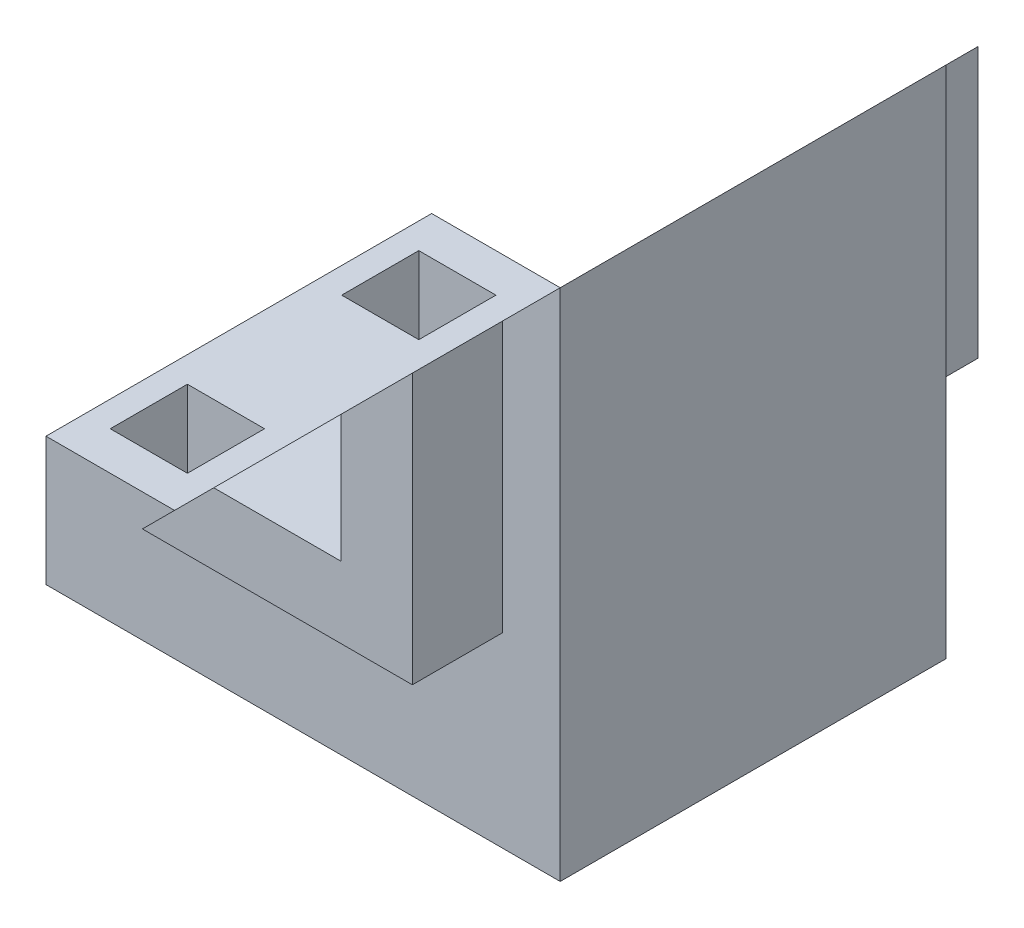
ISO-10303-21;
HEADER;
FILE_DESCRIPTION(('STEP AP214'),'2;1');
FILE_NAME('part.step','',(''),(''),'','','');
FILE_SCHEMA(('AUTOMOTIVE_DESIGN { 1 0 10303 214 1 1 1 1 }'));
ENDSEC;
DATA;
#1=APPLICATION_CONTEXT('core data for automotive mechanical design processes');
#2=APPLICATION_PROTOCOL_DEFINITION('international standard','automotive_design',2000,#1);
#3=PRODUCT_CONTEXT('',#1,'mechanical');
#4=PRODUCT('Part','Part','',(#3));
#5=PRODUCT_RELATED_PRODUCT_CATEGORY('part','',(#4));
#6=PRODUCT_DEFINITION_FORMATION('','',#4);
#7=PRODUCT_DEFINITION_CONTEXT('part definition',#1,'design');
#8=PRODUCT_DEFINITION('design','',#6,#7);
#9=PRODUCT_DEFINITION_SHAPE('','',#8);
#10=(LENGTH_UNIT() NAMED_UNIT(*) SI_UNIT(.MILLI.,.METRE.));
#11=(NAMED_UNIT(*) PLANE_ANGLE_UNIT() SI_UNIT($,.RADIAN.));
#12=(NAMED_UNIT(*) SI_UNIT($,.STERADIAN.) SOLID_ANGLE_UNIT());
#13=UNCERTAINTY_MEASURE_WITH_UNIT(LENGTH_MEASURE(1.E-05),#10,'distance_accuracy_value','');
#14=(GEOMETRIC_REPRESENTATION_CONTEXT(3) GLOBAL_UNCERTAINTY_ASSIGNED_CONTEXT((#13)) GLOBAL_UNIT_ASSIGNED_CONTEXT((#10,
#11,#12)) REPRESENTATION_CONTEXT('',''));
#15=CARTESIAN_POINT('',(0.,0.,0.));
#16=DIRECTION('',(0.,0.,1.));
#17=DIRECTION('',(1.,0.,0.));
#18=AXIS2_PLACEMENT_3D('',#15,#16,#17);
#19=CARTESIAN_POINT('',(0.,-20.,-15.));
#20=DIRECTION('',(0.,-1.,0.));
#21=DIRECTION('',(0.,0.,-1.));
#22=AXIS2_PLACEMENT_3D('',#19,#20,#21);
#23=PLANE('',#22);
#24=DIRECTION('',(0.,0.,1.));
#25=VECTOR('',#24,1.);
#26=CARTESIAN_POINT('',(20.,-20.,-15.));
#27=LINE('',#26,#25);
#28=CARTESIAN_POINT('',(20.,-20.,-15.));
#29=VERTEX_POINT('',#28);
#30=CARTESIAN_POINT('',(20.,-20.,15.));
#31=VERTEX_POINT('',#30);
#32=EDGE_CURVE('E43',#29,#31,#27,.T.);
#33=ORIENTED_EDGE('',*,*,#32,.T.);
#34=DIRECTION('',(1.,0.,0.));
#35=VECTOR('',#34,1.);
#36=CARTESIAN_POINT('',(0.,-20.,15.));
#37=LINE('',#36,#35);
#38=CARTESIAN_POINT('',(-20.,-20.,15.));
#39=VERTEX_POINT('',#38);
#40=EDGE_CURVE('E313',#39,#31,#37,.T.);
#41=ORIENTED_EDGE('',*,*,#40,.F.);
#42=DIRECTION('',(0.,0.,1.));
#43=VECTOR('',#42,1.);
#44=CARTESIAN_POINT('',(-20.,-20.,-15.));
#45=LINE('',#44,#43);
#46=CARTESIAN_POINT('',(-20.,-20.,-15.));
#47=VERTEX_POINT('',#46);
#48=EDGE_CURVE('E338',#47,#39,#45,.T.);
#49=ORIENTED_EDGE('',*,*,#48,.F.);
#50=DIRECTION('',(1.,0.,0.));
#51=VECTOR('',#50,1.);
#52=CARTESIAN_POINT('',(0.,-20.,-15.));
#53=LINE('',#52,#51);
#54=EDGE_CURVE('E331',#47,#29,#53,.T.);
#55=ORIENTED_EDGE('',*,*,#54,.T.);
#56=EDGE_LOOP('',(#33,#41,#49,#55));
#57=FACE_BOUND('',#56,.T.);
#58=DIRECTION('',(0.,0.,-1.));
#59=VECTOR('',#58,1.);
#60=CARTESIAN_POINT('',(-12.,-20.,6.));
#61=LINE('',#60,#59);
#62=CARTESIAN_POINT('',(-12.,-20.,12.));
#63=VERTEX_POINT('',#62);
#64=CARTESIAN_POINT('',(-12.,-20.,6.));
#65=VERTEX_POINT('',#64);
#66=EDGE_CURVE('E218',#63,#65,#61,.T.);
#67=ORIENTED_EDGE('',*,*,#66,.T.);
#68=DIRECTION('',(-1.,0.,0.));
#69=VECTOR('',#68,1.);
#70=CARTESIAN_POINT('',(-18.,-20.,6.));
#71=LINE('',#70,#69);
#72=CARTESIAN_POINT('',(-18.,-20.,6.));
#73=VERTEX_POINT('',#72);
#74=EDGE_CURVE('E221',#65,#73,#71,.T.);
#75=ORIENTED_EDGE('',*,*,#74,.T.);
#76=DIRECTION('',(0.,0.,1.));
#77=VECTOR('',#76,1.);
#78=CARTESIAN_POINT('',(-18.,-20.,6.));
#79=LINE('',#78,#77);
#80=CARTESIAN_POINT('',(-18.,-20.,12.));
#81=VERTEX_POINT('',#80);
#82=EDGE_CURVE('E225',#73,#81,#79,.T.);
#83=ORIENTED_EDGE('',*,*,#82,.T.);
#84=DIRECTION('',(1.,0.,0.));
#85=VECTOR('',#84,1.);
#86=CARTESIAN_POINT('',(-18.,-20.,12.));
#87=LINE('',#86,#85);
#88=EDGE_CURVE('E228',#81,#63,#87,.T.);
#89=ORIENTED_EDGE('',*,*,#88,.T.);
#90=EDGE_LOOP('',(#67,#75,#83,#89));
#91=FACE_BOUND('',#90,.T.);
#92=DIRECTION('',(-1.,0.,0.));
#93=VECTOR('',#92,1.);
#94=CARTESIAN_POINT('',(-18.,-20.,-6.));
#95=LINE('',#94,#93);
#96=CARTESIAN_POINT('',(-12.,-20.,-6.));
#97=VERTEX_POINT('',#96);
#98=CARTESIAN_POINT('',(-18.,-20.,-6.));
#99=VERTEX_POINT('',#98);
#100=EDGE_CURVE('E196',#97,#99,#95,.T.);
#101=ORIENTED_EDGE('',*,*,#100,.F.);
#102=DIRECTION('',(0.,0.,1.));
#103=VECTOR('',#102,1.);
#104=CARTESIAN_POINT('',(-12.,-20.,-6.));
#105=LINE('',#104,#103);
#106=CARTESIAN_POINT('',(-12.,-20.,-12.));
#107=VERTEX_POINT('',#106);
#108=EDGE_CURVE('E192',#107,#97,#105,.T.);
#109=ORIENTED_EDGE('',*,*,#108,.F.);
#110=DIRECTION('',(1.,0.,0.));
#111=VECTOR('',#110,1.);
#112=CARTESIAN_POINT('',(-18.,-20.,-12.));
#113=LINE('',#112,#111);
#114=CARTESIAN_POINT('',(-18.,-20.,-12.));
#115=VERTEX_POINT('',#114);
#116=EDGE_CURVE('E184',#115,#107,#113,.T.);
#117=ORIENTED_EDGE('',*,*,#116,.F.);
#118=DIRECTION('',(0.,0.,-1.));
#119=VECTOR('',#118,1.);
#120=CARTESIAN_POINT('',(-18.,-20.,-6.));
#121=LINE('',#120,#119);
#122=EDGE_CURVE('E191',#99,#115,#121,.T.);
#123=ORIENTED_EDGE('',*,*,#122,.F.);
#124=EDGE_LOOP('',(#101,#109,#117,#123));
#125=FACE_BOUND('',#124,.T.);
#126=ADVANCED_FACE('F34',(#57,#91,#125),#23,.T.);
#127=CARTESIAN_POINT('',(0.,-10.,-15.));
#128=DIRECTION('',(0.,-1.,0.));
#129=DIRECTION('',(0.,0.,-1.));
#130=AXIS2_PLACEMENT_3D('',#127,#128,#129);
#131=PLANE('',#130);
#132=DIRECTION('',(0.,0.,1.));
#133=VECTOR('',#132,1.);
#134=CARTESIAN_POINT('',(-20.,-10.,-15.));
#135=LINE('',#134,#133);
#136=CARTESIAN_POINT('',(-20.,-10.,-15.));
#137=VERTEX_POINT('',#136);
#138=CARTESIAN_POINT('',(-20.,-10.,15.));
#139=VERTEX_POINT('',#138);
#140=EDGE_CURVE('E339',#137,#139,#135,.T.);
#141=ORIENTED_EDGE('',*,*,#140,.T.);
#142=DIRECTION('',(1.,0.,0.));
#143=VECTOR('',#142,1.);
#144=CARTESIAN_POINT('',(0.,-10.,15.));
#145=LINE('',#144,#143);
#146=CARTESIAN_POINT('',(-10.,-10.,15.));
#147=VERTEX_POINT('',#146);
#148=EDGE_CURVE('E306',#139,#147,#145,.T.);
#149=ORIENTED_EDGE('',*,*,#148,.T.);
#150=DIRECTION('',(0.,0.,1.));
#151=VECTOR('',#150,1.);
#152=CARTESIAN_POINT('',(-10.,-10.,-15.));
#153=LINE('',#152,#151);
#154=CARTESIAN_POINT('',(-10.,-10.,-15.));
#155=VERTEX_POINT('',#154);
#156=EDGE_CURVE('E38',#155,#147,#153,.T.);
#157=ORIENTED_EDGE('',*,*,#156,.F.);
#158=DIRECTION('',(1.,0.,0.));
#159=VECTOR('',#158,1.);
#160=CARTESIAN_POINT('',(0.,-10.,-15.));
#161=LINE('',#160,#159);
#162=EDGE_CURVE('E326',#137,#155,#161,.T.);
#163=ORIENTED_EDGE('',*,*,#162,.F.);
#164=EDGE_LOOP('',(#141,#149,#157,#163));
#165=FACE_BOUND('',#164,.T.);
#166=DIRECTION('',(-1.,0.,0.));
#167=VECTOR('',#166,1.);
#168=CARTESIAN_POINT('',(-18.,-10.,6.));
#169=LINE('',#168,#167);
#170=CARTESIAN_POINT('',(-12.,-10.,6.));
#171=VERTEX_POINT('',#170);
#172=CARTESIAN_POINT('',(-18.,-10.,6.));
#173=VERTEX_POINT('',#172);
#174=EDGE_CURVE('E233',#171,#173,#169,.T.);
#175=ORIENTED_EDGE('',*,*,#174,.F.);
#176=DIRECTION('',(0.,0.,-1.));
#177=VECTOR('',#176,1.);
#178=CARTESIAN_POINT('',(-12.,-10.,6.));
#179=LINE('',#178,#177);
#180=CARTESIAN_POINT('',(-12.,-10.,12.));
#181=VERTEX_POINT('',#180);
#182=EDGE_CURVE('E214',#181,#171,#179,.T.);
#183=ORIENTED_EDGE('',*,*,#182,.F.);
#184=DIRECTION('',(1.,0.,0.));
#185=VECTOR('',#184,1.);
#186=CARTESIAN_POINT('',(-18.,-10.,12.));
#187=LINE('',#186,#185);
#188=CARTESIAN_POINT('',(-18.,-10.,12.));
#189=VERTEX_POINT('',#188);
#190=EDGE_CURVE('E222',#189,#181,#187,.T.);
#191=ORIENTED_EDGE('',*,*,#190,.F.);
#192=DIRECTION('',(0.,0.,1.));
#193=VECTOR('',#192,1.);
#194=CARTESIAN_POINT('',(-18.,-10.,6.));
#195=LINE('',#194,#193);
#196=EDGE_CURVE('E236',#173,#189,#195,.T.);
#197=ORIENTED_EDGE('',*,*,#196,.F.);
#198=EDGE_LOOP('',(#175,#183,#191,#197));
#199=FACE_BOUND('',#198,.T.);
#200=DIRECTION('',(0.,0.,1.));
#201=VECTOR('',#200,1.);
#202=CARTESIAN_POINT('',(-12.,-10.,-6.));
#203=LINE('',#202,#201);
#204=CARTESIAN_POINT('',(-12.,-10.,-12.));
#205=VERTEX_POINT('',#204);
#206=CARTESIAN_POINT('',(-12.,-10.,-6.));
#207=VERTEX_POINT('',#206);
#208=EDGE_CURVE('E59',#205,#207,#203,.T.);
#209=ORIENTED_EDGE('',*,*,#208,.T.);
#210=DIRECTION('',(-1.,0.,0.));
#211=VECTOR('',#210,1.);
#212=CARTESIAN_POINT('',(-18.,-10.,-6.));
#213=LINE('',#212,#211);
#214=CARTESIAN_POINT('',(-18.,-10.,-6.));
#215=VERTEX_POINT('',#214);
#216=EDGE_CURVE('E199',#207,#215,#213,.T.);
#217=ORIENTED_EDGE('',*,*,#216,.T.);
#218=DIRECTION('',(0.,0.,-1.));
#219=VECTOR('',#218,1.);
#220=CARTESIAN_POINT('',(-18.,-10.,-6.));
#221=LINE('',#220,#219);
#222=CARTESIAN_POINT('',(-18.,-10.,-12.));
#223=VERTEX_POINT('',#222);
#224=EDGE_CURVE('E202',#215,#223,#221,.T.);
#225=ORIENTED_EDGE('',*,*,#224,.T.);
#226=DIRECTION('',(1.,0.,0.));
#227=VECTOR('',#226,1.);
#228=CARTESIAN_POINT('',(-18.,-10.,-12.));
#229=LINE('',#228,#227);
#230=EDGE_CURVE('E208',#223,#205,#229,.T.);
#231=ORIENTED_EDGE('',*,*,#230,.T.);
#232=EDGE_LOOP('',(#209,#217,#225,#231));
#233=FACE_BOUND('',#232,.T.);
#234=ADVANCED_FACE('F36',(#165,#199,#233),#131,.F.);
#235=CARTESIAN_POINT('',(0.,0.,-15.));
#236=DIRECTION('',(0.707106781186547,-0.707106781186547,0.));
#237=DIRECTION('',(0.707106781186548,0.707106781186548,0.));
#238=AXIS2_PLACEMENT_3D('',#235,#236,#237);
#239=PLANE('',#238);
#240=DIRECTION('',(0.707106781186548,0.707106781186548,0.));
#241=VECTOR('',#240,1.);
#242=CARTESIAN_POINT('',(0.,0.,-15.));
#243=LINE('',#242,#241);
#244=CARTESIAN_POINT('',(15.5,15.5,-15.));
#245=VERTEX_POINT('',#244);
#246=CARTESIAN_POINT('',(20.,20.,-15.));
#247=VERTEX_POINT('',#246);
#248=EDGE_CURVE('E327',#245,#247,#243,.T.);
#249=ORIENTED_EDGE('',*,*,#248,.F.);
#250=DIRECTION('',(0.,0.,1.));
#251=VECTOR('',#250,1.);
#252=CARTESIAN_POINT('',(15.5,15.5,-22.));
#253=LINE('',#252,#251);
#254=CARTESIAN_POINT('',(15.5,15.5,-22.));
#255=VERTEX_POINT('',#254);
#256=EDGE_CURVE('E282',#255,#245,#253,.T.);
#257=ORIENTED_EDGE('',*,*,#256,.F.);
#258=DIRECTION('',(0.707106781186548,0.707106781186548,0.));
#259=VECTOR('',#258,1.);
#260=CARTESIAN_POINT('',(0.,0.,-22.));
#261=LINE('',#260,#259);
#262=CARTESIAN_POINT('',(9.94974746830583,9.94974746830583,-22.));
#263=VERTEX_POINT('',#262);
#264=EDGE_CURVE('E273',#263,#255,#261,.T.);
#265=ORIENTED_EDGE('',*,*,#264,.F.);
#266=DIRECTION('',(0.,0.,1.));
#267=VECTOR('',#266,1.);
#268=CARTESIAN_POINT('',(9.94974746830583,9.94974746830583,-22.));
#269=LINE('',#268,#267);
#270=CARTESIAN_POINT('',(9.94974746830583,9.94974746830583,22.));
#271=VERTEX_POINT('',#270);
#272=EDGE_CURVE('E279',#263,#271,#269,.T.);
#273=ORIENTED_EDGE('',*,*,#272,.T.);
#274=DIRECTION('',(0.707106781186548,0.707106781186548,0.));
#275=VECTOR('',#274,1.);
#276=CARTESIAN_POINT('',(0.,0.,22.));
#277=LINE('',#276,#275);
#278=CARTESIAN_POINT('',(15.5,15.5,22.));
#279=VERTEX_POINT('',#278);
#280=EDGE_CURVE('E259',#271,#279,#277,.T.);
#281=ORIENTED_EDGE('',*,*,#280,.T.);
#282=CARTESIAN_POINT('',(15.5,15.5,15.));
#283=VERTEX_POINT('',#282);
#284=EDGE_CURVE('E285',#283,#279,#253,.T.);
#285=ORIENTED_EDGE('',*,*,#284,.F.);
#286=DIRECTION('',(0.707106781186548,0.707106781186548,0.));
#287=VECTOR('',#286,1.);
#288=CARTESIAN_POINT('',(0.,0.,15.));
#289=LINE('',#288,#287);
#290=CARTESIAN_POINT('',(20.,20.,15.));
#291=VERTEX_POINT('',#290);
#292=EDGE_CURVE('E307',#283,#291,#289,.T.);
#293=ORIENTED_EDGE('',*,*,#292,.T.);
#294=DIRECTION('',(0.,0.,1.));
#295=VECTOR('',#294,1.);
#296=CARTESIAN_POINT('',(20.,20.,-15.));
#297=LINE('',#296,#295);
#298=EDGE_CURVE('E11',#247,#291,#297,.T.);
#299=ORIENTED_EDGE('',*,*,#298,.F.);
#300=EDGE_LOOP('',(#249,#257,#265,#273,#281,#285,#293,#299));
#301=FACE_BOUND('',#300,.T.);
#302=ADVANCED_FACE('F357',(#301),#239,.F.);
#303=CARTESIAN_POINT('',(20.,0.,-15.));
#304=DIRECTION('',(1.,0.,0.));
#305=DIRECTION('',(0.,0.,-1.));
#306=AXIS2_PLACEMENT_3D('',#303,#304,#305);
#307=PLANE('',#306);
#308=ORIENTED_EDGE('',*,*,#298,.T.);
#309=DIRECTION('',(0.,1.,0.));
#310=VECTOR('',#309,1.);
#311=CARTESIAN_POINT('',(20.,0.,15.));
#312=LINE('',#311,#310);
#313=EDGE_CURVE('E316',#31,#291,#312,.T.);
#314=ORIENTED_EDGE('',*,*,#313,.F.);
#315=ORIENTED_EDGE('',*,*,#32,.F.);
#316=DIRECTION('',(0.,1.,0.));
#317=VECTOR('',#316,1.);
#318=CARTESIAN_POINT('',(20.,0.,-15.));
#319=LINE('',#318,#317);
#320=EDGE_CURVE('E334',#29,#247,#319,.T.);
#321=ORIENTED_EDGE('',*,*,#320,.T.);
#322=EDGE_LOOP('',(#308,#314,#315,#321));
#323=FACE_BOUND('',#322,.T.);
#324=ADVANCED_FACE('F361',(#323),#307,.T.);
#325=CARTESIAN_POINT('',(-20.,0.,-15.));
#326=DIRECTION('',(1.,0.,0.));
#327=DIRECTION('',(0.,0.,-1.));
#328=AXIS2_PLACEMENT_3D('',#325,#326,#327);
#329=PLANE('',#328);
#330=ORIENTED_EDGE('',*,*,#48,.T.);
#331=DIRECTION('',(0.,1.,0.));
#332=VECTOR('',#331,1.);
#333=CARTESIAN_POINT('',(-20.,0.,15.));
#334=LINE('',#333,#332);
#335=EDGE_CURVE('E310',#39,#139,#334,.T.);
#336=ORIENTED_EDGE('',*,*,#335,.T.);
#337=ORIENTED_EDGE('',*,*,#140,.F.);
#338=DIRECTION('',(0.,1.,0.));
#339=VECTOR('',#338,1.);
#340=CARTESIAN_POINT('',(-20.,0.,-15.));
#341=LINE('',#340,#339);
#342=EDGE_CURVE('E329',#47,#137,#341,.T.);
#343=ORIENTED_EDGE('',*,*,#342,.F.);
#344=EDGE_LOOP('',(#330,#336,#337,#343));
#345=FACE_BOUND('',#344,.T.);
#346=ADVANCED_FACE('F369',(#345),#329,.F.);
#347=ORIENTED_EDGE('',*,*,#156,.T.);
#348=CARTESIAN_POINT('',(-5.5,-5.5,15.));
#349=VERTEX_POINT('',#348);
#350=EDGE_CURVE('E303',#147,#349,#289,.T.);
#351=ORIENTED_EDGE('',*,*,#350,.T.);
#352=DIRECTION('',(0.,0.,1.));
#353=VECTOR('',#352,1.);
#354=CARTESIAN_POINT('',(-5.5,-5.5,-22.));
#355=LINE('',#354,#353);
#356=CARTESIAN_POINT('',(-5.5,-5.5,22.));
#357=VERTEX_POINT('',#356);
#358=EDGE_CURVE('E293',#349,#357,#355,.T.);
#359=ORIENTED_EDGE('',*,*,#358,.T.);
#360=CARTESIAN_POINT('',(0.0502525316941692,0.0502525316941692,22.));
#361=VERTEX_POINT('',#360);
#362=EDGE_CURVE('E255',#357,#361,#277,.T.);
#363=ORIENTED_EDGE('',*,*,#362,.T.);
#364=DIRECTION('',(0.,0.,1.));
#365=VECTOR('',#364,1.);
#366=CARTESIAN_POINT('',(0.0502525316941692,0.0502525316941692,-22.));
#367=LINE('',#366,#365);
#368=CARTESIAN_POINT('',(0.0502525316941692,0.0502525316941692,-22.));
#369=VERTEX_POINT('',#368);
#370=EDGE_CURVE('E294',#369,#361,#367,.T.);
#371=ORIENTED_EDGE('',*,*,#370,.F.);
#372=CARTESIAN_POINT('',(-5.5,-5.5,-22.));
#373=VERTEX_POINT('',#372);
#374=EDGE_CURVE('E270',#373,#369,#261,.T.);
#375=ORIENTED_EDGE('',*,*,#374,.F.);
#376=CARTESIAN_POINT('',(-5.5,-5.5,-15.));
#377=VERTEX_POINT('',#376);
#378=EDGE_CURVE('E290',#373,#377,#355,.T.);
#379=ORIENTED_EDGE('',*,*,#378,.T.);
#380=EDGE_CURVE('E324',#155,#377,#243,.T.);
#381=ORIENTED_EDGE('',*,*,#380,.F.);
#382=EDGE_LOOP('',(#347,#351,#359,#363,#371,#375,#379,#381));
#383=FACE_BOUND('',#382,.T.);
#384=ADVANCED_FACE('F373',(#383),#239,.F.);
#385=CARTESIAN_POINT('',(0.,0.,-15.));
#386=DIRECTION('',(0.,0.,1.));
#387=DIRECTION('',(1.,0.,0.));
#388=AXIS2_PLACEMENT_3D('',#385,#386,#387);
#389=PLANE('',#388);
#390=DIRECTION('',(0.,1.,0.));
#391=VECTOR('',#390,1.);
#392=CARTESIAN_POINT('',(15.5,0.,-15.));
#393=LINE('',#392,#391);
#394=CARTESIAN_POINT('',(15.5,-5.5,-15.));
#395=VERTEX_POINT('',#394);
#396=EDGE_CURVE('E319',#395,#245,#393,.T.);
#397=ORIENTED_EDGE('',*,*,#396,.T.);
#398=ORIENTED_EDGE('',*,*,#248,.T.);
#399=ORIENTED_EDGE('',*,*,#320,.F.);
#400=ORIENTED_EDGE('',*,*,#54,.F.);
#401=ORIENTED_EDGE('',*,*,#342,.T.);
#402=ORIENTED_EDGE('',*,*,#162,.T.);
#403=ORIENTED_EDGE('',*,*,#380,.T.);
#404=DIRECTION('',(1.,0.,0.));
#405=VECTOR('',#404,1.);
#406=CARTESIAN_POINT('',(0.,-5.5,-15.));
#407=LINE('',#406,#405);
#408=EDGE_CURVE('E322',#377,#395,#407,.T.);
#409=ORIENTED_EDGE('',*,*,#408,.T.);
#410=EDGE_LOOP('',(#397,#398,#399,#400,#401,#402,#403,#409));
#411=FACE_BOUND('',#410,.T.);
#412=ADVANCED_FACE('F351',(#411),#389,.F.);
#413=CARTESIAN_POINT('',(0.,0.,15.));
#414=DIRECTION('',(0.,0.,1.));
#415=DIRECTION('',(1.,0.,0.));
#416=AXIS2_PLACEMENT_3D('',#413,#414,#415);
#417=PLANE('',#416);
#418=DIRECTION('',(0.,1.,0.));
#419=VECTOR('',#418,1.);
#420=CARTESIAN_POINT('',(15.5,0.,15.));
#421=LINE('',#420,#419);
#422=CARTESIAN_POINT('',(15.5,-5.5,15.));
#423=VERTEX_POINT('',#422);
#424=EDGE_CURVE('E281',#423,#283,#421,.T.);
#425=ORIENTED_EDGE('',*,*,#424,.F.);
#426=DIRECTION('',(1.,0.,0.));
#427=VECTOR('',#426,1.);
#428=CARTESIAN_POINT('',(0.,-5.5,15.));
#429=LINE('',#428,#427);
#430=EDGE_CURVE('E300',#349,#423,#429,.T.);
#431=ORIENTED_EDGE('',*,*,#430,.F.);
#432=ORIENTED_EDGE('',*,*,#350,.F.);
#433=ORIENTED_EDGE('',*,*,#148,.F.);
#434=ORIENTED_EDGE('',*,*,#335,.F.);
#435=ORIENTED_EDGE('',*,*,#40,.T.);
#436=ORIENTED_EDGE('',*,*,#313,.T.);
#437=ORIENTED_EDGE('',*,*,#292,.F.);
#438=EDGE_LOOP('',(#425,#431,#432,#433,#434,#435,#436,#437));
#439=FACE_BOUND('',#438,.T.);
#440=ADVANCED_FACE('F367',(#439),#417,.T.);
#441=CARTESIAN_POINT('',(15.5,0.,-22.));
#442=DIRECTION('',(1.,0.,0.));
#443=DIRECTION('',(0.,0.,-1.));
#444=AXIS2_PLACEMENT_3D('',#441,#442,#443);
#445=PLANE('',#444);
#446=ORIENTED_EDGE('',*,*,#396,.F.);
#447=DIRECTION('',(0.,0.,1.));
#448=VECTOR('',#447,1.);
#449=CARTESIAN_POINT('',(15.5,-5.5,-22.));
#450=LINE('',#449,#448);
#451=CARTESIAN_POINT('',(15.5,-5.5,-22.));
#452=VERTEX_POINT('',#451);
#453=EDGE_CURVE('E286',#452,#395,#450,.T.);
#454=ORIENTED_EDGE('',*,*,#453,.F.);
#455=DIRECTION('',(0.,1.,0.));
#456=VECTOR('',#455,1.);
#457=CARTESIAN_POINT('',(15.5,0.,-22.));
#458=LINE('',#457,#456);
#459=EDGE_CURVE('E276',#452,#255,#458,.T.);
#460=ORIENTED_EDGE('',*,*,#459,.T.);
#461=ORIENTED_EDGE('',*,*,#256,.T.);
#462=EDGE_LOOP('',(#446,#454,#460,#461));
#463=FACE_BOUND('',#462,.T.);
#464=ADVANCED_FACE('F380',(#463),#445,.T.);
#465=CARTESIAN_POINT('',(0.,-5.5,-22.));
#466=DIRECTION('',(0.,-1.,0.));
#467=DIRECTION('',(0.,0.,-1.));
#468=AXIS2_PLACEMENT_3D('',#465,#466,#467);
#469=PLANE('',#468);
#470=ORIENTED_EDGE('',*,*,#408,.F.);
#471=ORIENTED_EDGE('',*,*,#378,.F.);
#472=DIRECTION('',(1.,0.,0.));
#473=VECTOR('',#472,1.);
#474=CARTESIAN_POINT('',(0.,-5.5,-22.));
#475=LINE('',#474,#473);
#476=EDGE_CURVE('E272',#373,#452,#475,.T.);
#477=ORIENTED_EDGE('',*,*,#476,.T.);
#478=ORIENTED_EDGE('',*,*,#453,.T.);
#479=EDGE_LOOP('',(#470,#471,#477,#478));
#480=FACE_BOUND('',#479,.T.);
#481=ADVANCED_FACE('F378',(#480),#469,.T.);
#482=CARTESIAN_POINT('',(9.94974746830584,0.,-22.));
#483=DIRECTION('',(1.,0.,0.));
#484=DIRECTION('',(0.,0.,-1.));
#485=AXIS2_PLACEMENT_3D('',#482,#483,#484);
#486=PLANE('',#485);
#487=DIRECTION('',(0.,0.,1.));
#488=VECTOR('',#487,1.);
#489=CARTESIAN_POINT('',(9.94974746830584,0.0502525316941692,-22.));
#490=LINE('',#489,#488);
#491=CARTESIAN_POINT('',(9.94974746830584,0.0502525316941692,-22.));
#492=VERTEX_POINT('',#491);
#493=CARTESIAN_POINT('',(9.94974746830584,0.0502525316941692,22.));
#494=VERTEX_POINT('',#493);
#495=EDGE_CURVE('E296',#492,#494,#490,.T.);
#496=ORIENTED_EDGE('',*,*,#495,.T.);
#497=DIRECTION('',(0.,1.,0.));
#498=VECTOR('',#497,1.);
#499=CARTESIAN_POINT('',(9.94974746830584,0.,22.));
#500=LINE('',#499,#498);
#501=EDGE_CURVE('E243',#494,#271,#500,.T.);
#502=ORIENTED_EDGE('',*,*,#501,.T.);
#503=ORIENTED_EDGE('',*,*,#272,.F.);
#504=DIRECTION('',(0.,1.,0.));
#505=VECTOR('',#504,1.);
#506=CARTESIAN_POINT('',(9.94974746830584,0.,-22.));
#507=LINE('',#506,#505);
#508=EDGE_CURVE('E265',#492,#263,#507,.T.);
#509=ORIENTED_EDGE('',*,*,#508,.F.);
#510=EDGE_LOOP('',(#496,#502,#503,#509));
#511=FACE_BOUND('',#510,.T.);
#512=ADVANCED_FACE('F390',(#511),#486,.F.);
#513=CARTESIAN_POINT('',(15.5,-5.5,22.));
#514=VERTEX_POINT('',#513);
#515=EDGE_CURVE('E289',#423,#514,#450,.T.);
#516=ORIENTED_EDGE('',*,*,#515,.F.);
#517=ORIENTED_EDGE('',*,*,#424,.T.);
#518=ORIENTED_EDGE('',*,*,#284,.T.);
#519=DIRECTION('',(0.,1.,0.));
#520=VECTOR('',#519,1.);
#521=CARTESIAN_POINT('',(15.5,0.,22.));
#522=LINE('',#521,#520);
#523=EDGE_CURVE('E262',#514,#279,#522,.T.);
#524=ORIENTED_EDGE('',*,*,#523,.F.);
#525=EDGE_LOOP('',(#516,#517,#518,#524));
#526=FACE_BOUND('',#525,.T.);
#527=ADVANCED_FACE('F399',(#526),#445,.T.);
#528=ORIENTED_EDGE('',*,*,#358,.F.);
#529=ORIENTED_EDGE('',*,*,#430,.T.);
#530=ORIENTED_EDGE('',*,*,#515,.T.);
#531=DIRECTION('',(1.,0.,0.));
#532=VECTOR('',#531,1.);
#533=CARTESIAN_POINT('',(0.,-5.5,22.));
#534=LINE('',#533,#532);
#535=EDGE_CURVE('E258',#357,#514,#534,.T.);
#536=ORIENTED_EDGE('',*,*,#535,.F.);
#537=EDGE_LOOP('',(#528,#529,#530,#536));
#538=FACE_BOUND('',#537,.T.);
#539=ADVANCED_FACE('F402',(#538),#469,.T.);
#540=CARTESIAN_POINT('',(0.,0.0502525316941692,-22.));
#541=DIRECTION('',(0.,-1.,0.));
#542=DIRECTION('',(0.,0.,-1.));
#543=AXIS2_PLACEMENT_3D('',#540,#541,#542);
#544=PLANE('',#543);
#545=ORIENTED_EDGE('',*,*,#370,.T.);
#546=DIRECTION('',(1.,0.,0.));
#547=VECTOR('',#546,1.);
#548=CARTESIAN_POINT('',(0.,0.0502525316941692,22.));
#549=LINE('',#548,#547);
#550=EDGE_CURVE('E252',#361,#494,#549,.T.);
#551=ORIENTED_EDGE('',*,*,#550,.T.);
#552=ORIENTED_EDGE('',*,*,#495,.F.);
#553=DIRECTION('',(1.,0.,0.));
#554=VECTOR('',#553,1.);
#555=CARTESIAN_POINT('',(0.,0.0502525316941692,-22.));
#556=LINE('',#555,#554);
#557=EDGE_CURVE('E268',#369,#492,#556,.T.);
#558=ORIENTED_EDGE('',*,*,#557,.F.);
#559=EDGE_LOOP('',(#545,#551,#552,#558));
#560=FACE_BOUND('',#559,.T.);
#561=ADVANCED_FACE('F406',(#560),#544,.F.);
#562=CARTESIAN_POINT('',(0.,0.,-22.));
#563=DIRECTION('',(0.,0.,1.));
#564=DIRECTION('',(1.,0.,0.));
#565=AXIS2_PLACEMENT_3D('',#562,#563,#564);
#566=PLANE('',#565);
#567=ORIENTED_EDGE('',*,*,#508,.T.);
#568=ORIENTED_EDGE('',*,*,#264,.T.);
#569=ORIENTED_EDGE('',*,*,#459,.F.);
#570=ORIENTED_EDGE('',*,*,#476,.F.);
#571=ORIENTED_EDGE('',*,*,#374,.T.);
#572=ORIENTED_EDGE('',*,*,#557,.T.);
#573=EDGE_LOOP('',(#567,#568,#569,#570,#571,#572));
#574=FACE_BOUND('',#573,.T.);
#575=ADVANCED_FACE('F386',(#574),#566,.F.);
#576=CARTESIAN_POINT('',(0.,0.,22.));
#577=DIRECTION('',(0.,0.,1.));
#578=DIRECTION('',(1.,0.,0.));
#579=AXIS2_PLACEMENT_3D('',#576,#577,#578);
#580=PLANE('',#579);
#581=ORIENTED_EDGE('',*,*,#501,.F.);
#582=ORIENTED_EDGE('',*,*,#550,.F.);
#583=ORIENTED_EDGE('',*,*,#362,.F.);
#584=ORIENTED_EDGE('',*,*,#535,.T.);
#585=ORIENTED_EDGE('',*,*,#523,.T.);
#586=ORIENTED_EDGE('',*,*,#280,.F.);
#587=EDGE_LOOP('',(#581,#582,#583,#584,#585,#586));
#588=FACE_BOUND('',#587,.T.);
#589=ADVANCED_FACE('F395',(#588),#580,.T.);
#590=CARTESIAN_POINT('',(-12.,-20.,6.));
#591=DIRECTION('',(1.,0.,0.));
#592=DIRECTION('',(0.,0.,-1.));
#593=AXIS2_PLACEMENT_3D('',#590,#591,#592);
#594=PLANE('',#593);
#595=ORIENTED_EDGE('',*,*,#182,.T.);
#596=DIRECTION('',(0.,1.,0.));
#597=VECTOR('',#596,1.);
#598=CARTESIAN_POINT('',(-12.,-20.,6.));
#599=LINE('',#598,#597);
#600=EDGE_CURVE('E231',#65,#171,#599,.T.);
#601=ORIENTED_EDGE('',*,*,#600,.F.);
#602=ORIENTED_EDGE('',*,*,#66,.F.);
#603=DIRECTION('',(0.,1.,0.));
#604=VECTOR('',#603,1.);
#605=CARTESIAN_POINT('',(-12.,-20.,12.));
#606=LINE('',#605,#604);
#607=EDGE_CURVE('E241',#63,#181,#606,.T.);
#608=ORIENTED_EDGE('',*,*,#607,.T.);
#609=EDGE_LOOP('',(#595,#601,#602,#608));
#610=FACE_BOUND('',#609,.T.);
#611=ADVANCED_FACE('F449',(#610),#594,.F.);
#612=CARTESIAN_POINT('',(-18.,-20.,12.));
#613=DIRECTION('',(0.,0.,1.));
#614=DIRECTION('',(1.,0.,0.));
#615=AXIS2_PLACEMENT_3D('',#612,#613,#614);
#616=PLANE('',#615);
#617=ORIENTED_EDGE('',*,*,#190,.T.);
#618=ORIENTED_EDGE('',*,*,#607,.F.);
#619=ORIENTED_EDGE('',*,*,#88,.F.);
#620=DIRECTION('',(0.,1.,0.));
#621=VECTOR('',#620,1.);
#622=CARTESIAN_POINT('',(-18.,-20.,12.));
#623=LINE('',#622,#621);
#624=EDGE_CURVE('E244',#81,#189,#623,.T.);
#625=ORIENTED_EDGE('',*,*,#624,.T.);
#626=EDGE_LOOP('',(#617,#618,#619,#625));
#627=FACE_BOUND('',#626,.T.);
#628=ADVANCED_FACE('F452',(#627),#616,.F.);
#629=CARTESIAN_POINT('',(-18.,-20.,6.));
#630=DIRECTION('',(-1.,0.,0.));
#631=DIRECTION('',(0.,0.,1.));
#632=AXIS2_PLACEMENT_3D('',#629,#630,#631);
#633=PLANE('',#632);
#634=ORIENTED_EDGE('',*,*,#196,.T.);
#635=ORIENTED_EDGE('',*,*,#624,.F.);
#636=ORIENTED_EDGE('',*,*,#82,.F.);
#637=DIRECTION('',(0.,1.,0.));
#638=VECTOR('',#637,1.);
#639=CARTESIAN_POINT('',(-18.,-20.,6.));
#640=LINE('',#639,#638);
#641=EDGE_CURVE('E246',#73,#173,#640,.T.);
#642=ORIENTED_EDGE('',*,*,#641,.T.);
#643=EDGE_LOOP('',(#634,#635,#636,#642));
#644=FACE_BOUND('',#643,.T.);
#645=ADVANCED_FACE('F457',(#644),#633,.F.);
#646=CARTESIAN_POINT('',(-18.,-20.,6.));
#647=DIRECTION('',(0.,0.,-1.));
#648=DIRECTION('',(-1.,0.,0.));
#649=AXIS2_PLACEMENT_3D('',#646,#647,#648);
#650=PLANE('',#649);
#651=ORIENTED_EDGE('',*,*,#174,.T.);
#652=ORIENTED_EDGE('',*,*,#641,.F.);
#653=ORIENTED_EDGE('',*,*,#74,.F.);
#654=ORIENTED_EDGE('',*,*,#600,.T.);
#655=EDGE_LOOP('',(#651,#652,#653,#654));
#656=FACE_BOUND('',#655,.T.);
#657=ADVANCED_FACE('F454',(#656),#650,.F.);
#658=CARTESIAN_POINT('',(-12.,-20.,-6.));
#659=DIRECTION('',(-1.,0.,0.));
#660=DIRECTION('',(0.,0.,1.));
#661=AXIS2_PLACEMENT_3D('',#658,#659,#660);
#662=PLANE('',#661);
#663=ORIENTED_EDGE('',*,*,#208,.F.);
#664=DIRECTION('',(0.,1.,0.));
#665=VECTOR('',#664,1.);
#666=CARTESIAN_POINT('',(-12.,-20.,-12.));
#667=LINE('',#666,#665);
#668=EDGE_CURVE('E186',#107,#205,#667,.T.);
#669=ORIENTED_EDGE('',*,*,#668,.F.);
#670=ORIENTED_EDGE('',*,*,#108,.T.);
#671=DIRECTION('',(0.,1.,0.));
#672=VECTOR('',#671,1.);
#673=CARTESIAN_POINT('',(-12.,-20.,-6.));
#674=LINE('',#673,#672);
#675=EDGE_CURVE('E212',#97,#207,#674,.T.);
#676=ORIENTED_EDGE('',*,*,#675,.T.);
#677=EDGE_LOOP('',(#663,#669,#670,#676));
#678=FACE_BOUND('',#677,.T.);
#679=ADVANCED_FACE('F194',(#678),#662,.T.);
#680=CARTESIAN_POINT('',(-18.,-20.,-6.));
#681=DIRECTION('',(0.,0.,-1.));
#682=DIRECTION('',(-1.,0.,0.));
#683=AXIS2_PLACEMENT_3D('',#680,#681,#682);
#684=PLANE('',#683);
#685=ORIENTED_EDGE('',*,*,#216,.F.);
#686=ORIENTED_EDGE('',*,*,#675,.F.);
#687=ORIENTED_EDGE('',*,*,#100,.T.);
#688=DIRECTION('',(0.,1.,0.));
#689=VECTOR('',#688,1.);
#690=CARTESIAN_POINT('',(-18.,-20.,-6.));
#691=LINE('',#690,#689);
#692=EDGE_CURVE('E215',#99,#215,#691,.T.);
#693=ORIENTED_EDGE('',*,*,#692,.T.);
#694=EDGE_LOOP('',(#685,#686,#687,#693));
#695=FACE_BOUND('',#694,.T.);
#696=ADVANCED_FACE('F467',(#695),#684,.T.);
#697=CARTESIAN_POINT('',(-18.,-20.,-6.));
#698=DIRECTION('',(1.,0.,0.));
#699=DIRECTION('',(0.,0.,-1.));
#700=AXIS2_PLACEMENT_3D('',#697,#698,#699);
#701=PLANE('',#700);
#702=ORIENTED_EDGE('',*,*,#224,.F.);
#703=ORIENTED_EDGE('',*,*,#692,.F.);
#704=ORIENTED_EDGE('',*,*,#122,.T.);
#705=DIRECTION('',(0.,1.,0.));
#706=VECTOR('',#705,1.);
#707=CARTESIAN_POINT('',(-18.,-20.,-12.));
#708=LINE('',#707,#706);
#709=EDGE_CURVE('E51',#115,#223,#708,.T.);
#710=ORIENTED_EDGE('',*,*,#709,.T.);
#711=EDGE_LOOP('',(#702,#703,#704,#710));
#712=FACE_BOUND('',#711,.T.);
#713=ADVANCED_FACE('F470',(#712),#701,.T.);
#714=CARTESIAN_POINT('',(-18.,-20.,-12.));
#715=DIRECTION('',(0.,0.,1.));
#716=DIRECTION('',(1.,0.,0.));
#717=AXIS2_PLACEMENT_3D('',#714,#715,#716);
#718=PLANE('',#717);
#719=ORIENTED_EDGE('',*,*,#230,.F.);
#720=ORIENTED_EDGE('',*,*,#709,.F.);
#721=ORIENTED_EDGE('',*,*,#116,.T.);
#722=ORIENTED_EDGE('',*,*,#668,.T.);
#723=EDGE_LOOP('',(#719,#720,#721,#722));
#724=FACE_BOUND('',#723,.T.);
#725=ADVANCED_FACE('F185',(#724),#718,.T.);
#726=CLOSED_SHELL('',(#126,#234,#302,#324,#346,#384,#412,#440,#464,#481,#512,#527,#539,#561,
#575,#589,#611,#628,#645,#657,#679,#696,#713,#725));
#727=MANIFOLD_SOLID_BREP('B2',#726);
#728=ADVANCED_BREP_SHAPE_REPRESENTATION('',(#18,#727),#14);
#729=SHAPE_DEFINITION_REPRESENTATION(#9,#728);
ENDSEC;
END-ISO-10303-21;
